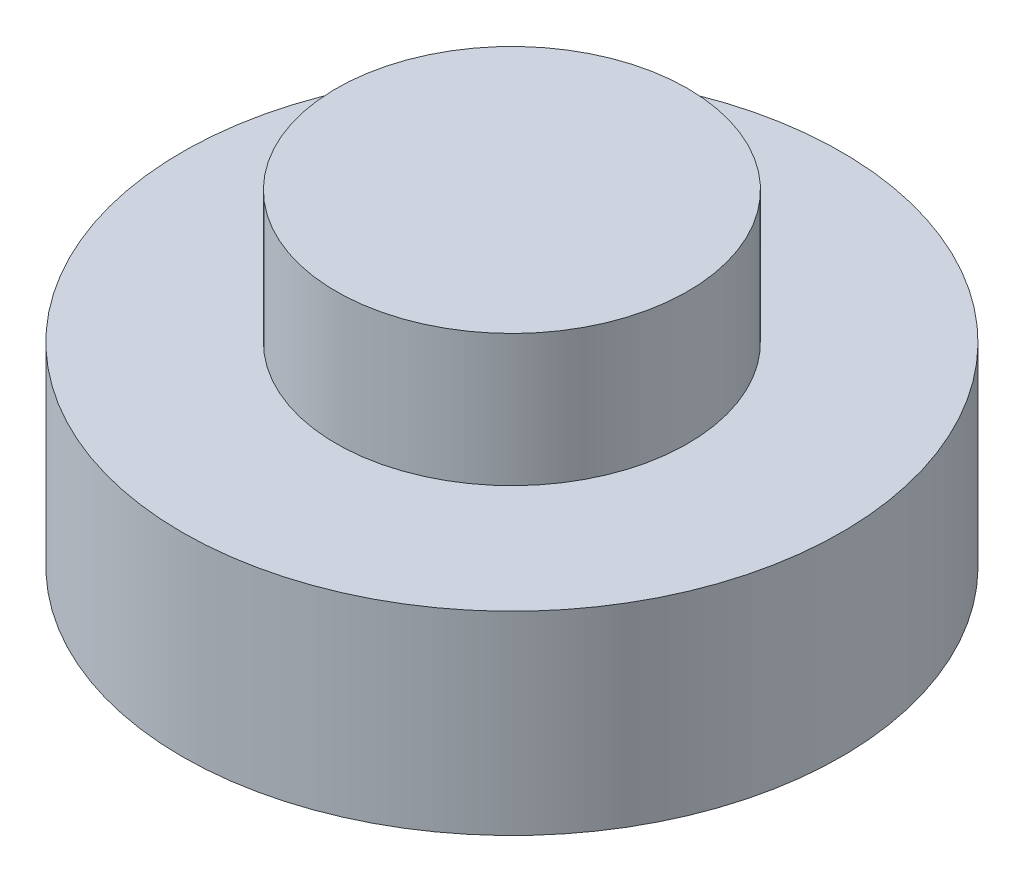
ISO-10303-21;
HEADER;
FILE_DESCRIPTION(('STEP AP214'),'2;1');
FILE_NAME('part.step','',(''),(''),'','','');
FILE_SCHEMA(('AUTOMOTIVE_DESIGN { 1 0 10303 214 1 1 1 1 }'));
ENDSEC;
DATA;
#1=APPLICATION_CONTEXT('core data for automotive mechanical design processes');
#2=APPLICATION_PROTOCOL_DEFINITION('international standard','automotive_design',2000,#1);
#3=PRODUCT_CONTEXT('',#1,'mechanical');
#4=PRODUCT('Part','Part','',(#3));
#5=PRODUCT_RELATED_PRODUCT_CATEGORY('part','',(#4));
#6=PRODUCT_DEFINITION_FORMATION('','',#4);
#7=PRODUCT_DEFINITION_CONTEXT('part definition',#1,'design');
#8=PRODUCT_DEFINITION('design','',#6,#7);
#9=PRODUCT_DEFINITION_SHAPE('','',#8);
#10=(LENGTH_UNIT() NAMED_UNIT(*) SI_UNIT(.MILLI.,.METRE.));
#11=(NAMED_UNIT(*) PLANE_ANGLE_UNIT() SI_UNIT($,.RADIAN.));
#12=(NAMED_UNIT(*) SI_UNIT($,.STERADIAN.) SOLID_ANGLE_UNIT());
#13=UNCERTAINTY_MEASURE_WITH_UNIT(LENGTH_MEASURE(1.E-05),#10,'distance_accuracy_value','');
#14=(GEOMETRIC_REPRESENTATION_CONTEXT(3) GLOBAL_UNCERTAINTY_ASSIGNED_CONTEXT((#13)) GLOBAL_UNIT_ASSIGNED_CONTEXT((#10,
#11,#12)) REPRESENTATION_CONTEXT('',''));
#15=CARTESIAN_POINT('',(0.,0.,0.));
#16=DIRECTION('',(0.,0.,1.));
#17=DIRECTION('',(1.,0.,0.));
#18=AXIS2_PLACEMENT_3D('',#15,#16,#17);
#19=CARTESIAN_POINT('',(0.,4.42,0.));
#20=DIRECTION('',(0.,1.,0.));
#21=DIRECTION('',(0.,0.,1.));
#22=AXIS2_PLACEMENT_3D('',#19,#20,#21);
#23=PLANE('',#22);
#24=CARTESIAN_POINT('',(0.,4.42,0.));
#25=DIRECTION('',(0.,1.,0.));
#26=DIRECTION('',(0.,0.,1.));
#27=AXIS2_PLACEMENT_3D('',#24,#25,#26);
#28=CIRCLE('',#27,7.5);
#29=CARTESIAN_POINT('',(0.,4.42,7.5));
#30=VERTEX_POINT('',#29);
#31=EDGE_CURVE('E10',#30,#30,#28,.T.);
#32=ORIENTED_EDGE('',*,*,#31,.T.);
#33=EDGE_LOOP('',(#32));
#34=FACE_BOUND('',#33,.T.);
#35=CARTESIAN_POINT('',(0.,4.42,0.));
#36=DIRECTION('',(0.,1.,0.));
#37=DIRECTION('',(0.,0.,1.));
#38=AXIS2_PLACEMENT_3D('',#35,#36,#37);
#39=CIRCLE('',#38,4.);
#40=CARTESIAN_POINT('',(0.,4.42,-4.));
#41=VERTEX_POINT('',#40);
#42=EDGE_CURVE('E43',#41,#41,#39,.T.);
#43=ORIENTED_EDGE('',*,*,#42,.F.);
#44=EDGE_LOOP('',(#43));
#45=FACE_BOUND('',#44,.T.);
#46=ADVANCED_FACE('F32',(#34,#45),#23,.T.);
#47=CARTESIAN_POINT('',(0.,0.,0.));
#48=DIRECTION('',(0.,1.,0.));
#49=DIRECTION('',(0.,0.,1.));
#50=AXIS2_PLACEMENT_3D('',#47,#48,#49);
#51=PLANE('',#50);
#52=CARTESIAN_POINT('',(0.,0.,0.));
#53=DIRECTION('',(0.,1.,0.));
#54=DIRECTION('',(0.,0.,1.));
#55=AXIS2_PLACEMENT_3D('',#52,#53,#54);
#56=CIRCLE('',#55,7.5);
#57=CARTESIAN_POINT('',(0.,0.,7.5));
#58=VERTEX_POINT('',#57);
#59=EDGE_CURVE('E36',#58,#58,#56,.T.);
#60=ORIENTED_EDGE('',*,*,#59,.F.);
#61=EDGE_LOOP('',(#60));
#62=FACE_BOUND('',#61,.T.);
#63=ADVANCED_FACE('F62',(#62),#51,.F.);
#64=CARTESIAN_POINT('',(0.,4.42,0.));
#65=DIRECTION('',(0.,-1.,0.));
#66=DIRECTION('',(0.,0.,-1.));
#67=AXIS2_PLACEMENT_3D('',#64,#65,#66);
#68=CYLINDRICAL_SURFACE('',#67,7.5);
#69=ORIENTED_EDGE('',*,*,#31,.F.);
#70=EDGE_LOOP('',(#69));
#71=FACE_BOUND('',#70,.T.);
#72=ORIENTED_EDGE('',*,*,#59,.T.);
#73=EDGE_LOOP('',(#72));
#74=FACE_BOUND('',#73,.T.);
#75=ADVANCED_FACE('F34',(#71,#74),#68,.T.);
#76=CARTESIAN_POINT('',(0.,7.42,0.));
#77=DIRECTION('',(0.,-1.,0.));
#78=DIRECTION('',(0.,0.,-1.));
#79=AXIS2_PLACEMENT_3D('',#76,#77,#78);
#80=CYLINDRICAL_SURFACE('',#79,4.);
#81=CARTESIAN_POINT('',(0.,7.42,0.));
#82=DIRECTION('',(0.,1.,0.));
#83=DIRECTION('',(0.,0.,1.));
#84=AXIS2_PLACEMENT_3D('',#81,#82,#83);
#85=CIRCLE('',#84,4.);
#86=CARTESIAN_POINT('',(0.,7.42,-4.));
#87=VERTEX_POINT('',#86);
#88=EDGE_CURVE('E47',#87,#87,#85,.T.);
#89=CARTESIAN_POINT('',(0.,4.42,-4.));
#90=CARTESIAN_POINT('',(0.,4.45125,-4.));
#91=CARTESIAN_POINT('',(0.,4.4825,-4.));
#92=CARTESIAN_POINT('',(0.,4.545,-4.));
#93=CARTESIAN_POINT('',(0.,4.57625,-4.));
#94=CARTESIAN_POINT('',(0.,4.63875,-4.));
#95=CARTESIAN_POINT('',(0.,4.67,-4.));
#96=CARTESIAN_POINT('',(0.,4.7325,-4.));
#97=CARTESIAN_POINT('',(0.,4.76375,-4.));
#98=CARTESIAN_POINT('',(0.,4.82625,-4.));
#99=CARTESIAN_POINT('',(0.,4.8575,-4.));
#100=CARTESIAN_POINT('',(0.,4.92,-4.));
#101=CARTESIAN_POINT('',(0.,4.95125,-4.));
#102=CARTESIAN_POINT('',(0.,5.01375,-4.));
#103=CARTESIAN_POINT('',(0.,5.045,-4.));
#104=CARTESIAN_POINT('',(0.,5.1075,-4.));
#105=CARTESIAN_POINT('',(0.,5.13875,-4.));
#106=CARTESIAN_POINT('',(0.,5.20125,-4.));
#107=CARTESIAN_POINT('',(0.,5.2325,-4.));
#108=CARTESIAN_POINT('',(0.,5.295,-4.));
#109=CARTESIAN_POINT('',(0.,5.32625,-4.));
#110=CARTESIAN_POINT('',(0.,5.38875,-4.));
#111=CARTESIAN_POINT('',(0.,5.42,-4.));
#112=CARTESIAN_POINT('',(0.,5.4825,-4.));
#113=CARTESIAN_POINT('',(0.,5.51375,-4.));
#114=CARTESIAN_POINT('',(0.,5.57625,-4.));
#115=CARTESIAN_POINT('',(0.,5.6075,-4.));
#116=CARTESIAN_POINT('',(0.,5.67,-4.));
#117=CARTESIAN_POINT('',(0.,5.70125,-4.));
#118=CARTESIAN_POINT('',(0.,5.76375,-4.));
#119=CARTESIAN_POINT('',(0.,5.795,-4.));
#120=CARTESIAN_POINT('',(0.,5.8575,-4.));
#121=CARTESIAN_POINT('',(0.,5.88875,-4.));
#122=CARTESIAN_POINT('',(0.,5.95125,-4.));
#123=CARTESIAN_POINT('',(0.,5.9825,-4.));
#124=CARTESIAN_POINT('',(0.,6.045,-4.));
#125=CARTESIAN_POINT('',(0.,6.07625,-4.));
#126=CARTESIAN_POINT('',(0.,6.13875,-4.));
#127=CARTESIAN_POINT('',(0.,6.17,-4.));
#128=CARTESIAN_POINT('',(0.,6.2325,-4.));
#129=CARTESIAN_POINT('',(0.,6.26375,-4.));
#130=CARTESIAN_POINT('',(0.,6.32625,-4.));
#131=CARTESIAN_POINT('',(0.,6.3575,-4.));
#132=CARTESIAN_POINT('',(0.,6.42,-4.));
#133=CARTESIAN_POINT('',(0.,6.45125,-4.));
#134=CARTESIAN_POINT('',(0.,6.51375,-4.));
#135=CARTESIAN_POINT('',(0.,6.545,-4.));
#136=CARTESIAN_POINT('',(0.,6.6075,-4.));
#137=CARTESIAN_POINT('',(0.,6.63875,-4.));
#138=CARTESIAN_POINT('',(0.,6.70125,-4.));
#139=CARTESIAN_POINT('',(0.,6.7325,-4.));
#140=CARTESIAN_POINT('',(0.,6.795,-4.));
#141=CARTESIAN_POINT('',(0.,6.82625,-4.));
#142=CARTESIAN_POINT('',(0.,6.88875,-4.));
#143=CARTESIAN_POINT('',(0.,6.92,-4.));
#144=CARTESIAN_POINT('',(0.,6.9825,-4.));
#145=CARTESIAN_POINT('',(0.,7.01375,-4.));
#146=CARTESIAN_POINT('',(0.,7.07625,-4.));
#147=CARTESIAN_POINT('',(0.,7.1075,-4.));
#148=CARTESIAN_POINT('',(0.,7.17,-4.));
#149=CARTESIAN_POINT('',(0.,7.20125,-4.));
#150=CARTESIAN_POINT('',(0.,7.26375,-4.));
#151=CARTESIAN_POINT('',(0.,7.295,-4.));
#152=CARTESIAN_POINT('',(0.,7.3575,-4.));
#153=CARTESIAN_POINT('',(0.,7.38875,-4.));
#154=CARTESIAN_POINT('',(0.,7.42,-4.));
#155=B_SPLINE_CURVE_WITH_KNOTS('',3,(#89,#90,#91,#92,#93,#94,#95,#96,#97,#98,#99,#100,#101,#102,
#103,#104,#105,#106,#107,#108,#109,#110,#111,#112,#113,#114,#115,#116,#117,#118,#119,#120,#121,
#122,#123,#124,#125,#126,#127,#128,#129,#130,#131,#132,#133,#134,#135,#136,#137,#138,#139,#140,
#141,#142,#143,#144,#145,#146,#147,#148,#149,#150,#151,#152,#153,#154),.UNSPECIFIED.,.F.,.F.,(4,
2,2,2,2,2,2,2,2,2,2,2,2,2,2,2,2,2,2,2,2,2,2,2,2,2,2,2,2,2,2,2,4),(0.,0.0937500000000001,0.1875,
0.281249999999999,0.374999999999999,0.46875,0.5625,0.656249999999999,0.749999999999999,
0.843749999999999,0.937499999999999,1.03125,1.125,1.21875,1.3125,1.40625,1.5,1.59375,1.6875,
1.78125,1.875,1.96875,2.0625,2.15625,2.25,2.34375,2.4375,2.53125,2.625,2.71875,2.8125,2.90625,
3.),.UNSPECIFIED.);
#156=EDGE_CURVE('BSEAM53',#41,#87,#155,.T.);
#157=ORIENTED_EDGE('',*,*,#42,.T.);
#158=ORIENTED_EDGE('',*,*,#88,.F.);
#159=ORIENTED_EDGE('',*,*,#156,.T.);
#160=ORIENTED_EDGE('',*,*,#156,.F.);
#161=EDGE_LOOP('',(#157,#159,#158,#160));
#162=FACE_BOUND('',#161,.T.);
#163=ADVANCED_FACE('F53',(#162),#80,.T.);
#164=CARTESIAN_POINT('',(0.,7.42,0.));
#165=DIRECTION('',(0.,1.,0.));
#166=DIRECTION('',(0.,0.,1.));
#167=AXIS2_PLACEMENT_3D('',#164,#165,#166);
#168=PLANE('',#167);
#169=ORIENTED_EDGE('',*,*,#88,.T.);
#170=EDGE_LOOP('',(#169));
#171=FACE_BOUND('',#170,.T.);
#172=ADVANCED_FACE('F51',(#171),#168,.T.);
#173=CLOSED_SHELL('',(#46,#63,#75,#163,#172));
#174=MANIFOLD_SOLID_BREP('B2',#173);
#175=ADVANCED_BREP_SHAPE_REPRESENTATION('',(#18,#174),#14);
#176=SHAPE_DEFINITION_REPRESENTATION(#9,#175);
ENDSEC;
END-ISO-10303-21;
